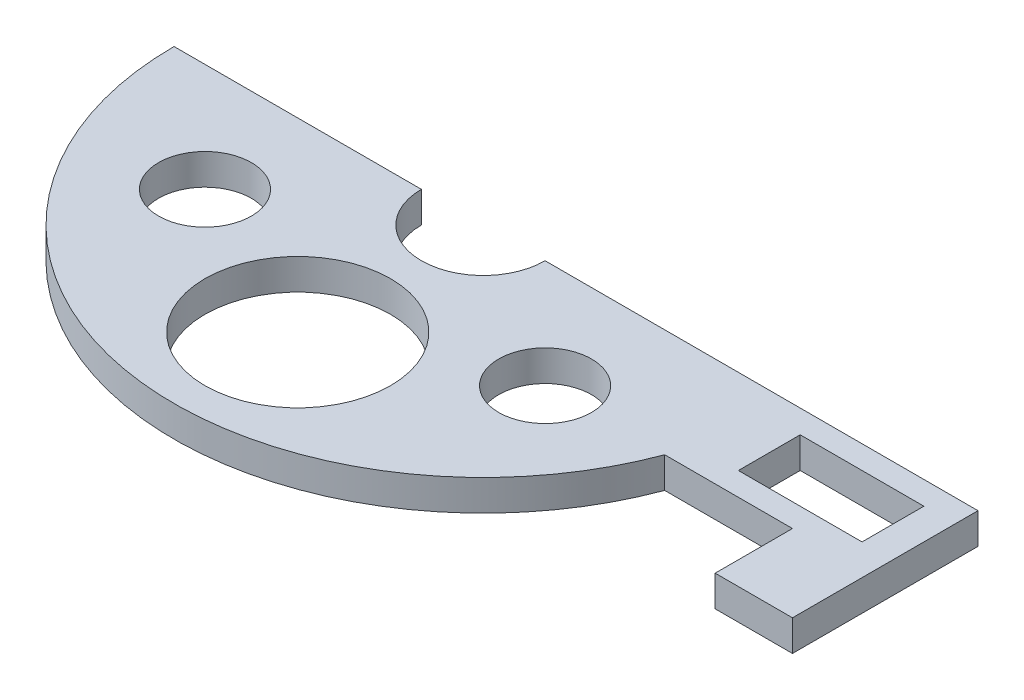
ISO-10303-21;
HEADER;
FILE_DESCRIPTION(('STEP AP214'),'2;1');
FILE_NAME('part.step','',(''),(''),'','','');
FILE_SCHEMA(('AUTOMOTIVE_DESIGN { 1 0 10303 214 1 1 1 1 }'));
ENDSEC;
DATA;
#1=APPLICATION_CONTEXT('core data for automotive mechanical design processes');
#2=APPLICATION_PROTOCOL_DEFINITION('international standard','automotive_design',2000,#1);
#3=PRODUCT_CONTEXT('',#1,'mechanical');
#4=PRODUCT('Part','Part','',(#3));
#5=PRODUCT_RELATED_PRODUCT_CATEGORY('part','',(#4));
#6=PRODUCT_DEFINITION_FORMATION('','',#4);
#7=PRODUCT_DEFINITION_CONTEXT('part definition',#1,'design');
#8=PRODUCT_DEFINITION('design','',#6,#7);
#9=PRODUCT_DEFINITION_SHAPE('','',#8);
#10=(LENGTH_UNIT() NAMED_UNIT(*) SI_UNIT(.MILLI.,.METRE.));
#11=(NAMED_UNIT(*) PLANE_ANGLE_UNIT() SI_UNIT($,.RADIAN.));
#12=(NAMED_UNIT(*) SI_UNIT($,.STERADIAN.) SOLID_ANGLE_UNIT());
#13=UNCERTAINTY_MEASURE_WITH_UNIT(LENGTH_MEASURE(1.E-05),#10,'distance_accuracy_value','');
#14=(GEOMETRIC_REPRESENTATION_CONTEXT(3) GLOBAL_UNCERTAINTY_ASSIGNED_CONTEXT((#13)) GLOBAL_UNIT_ASSIGNED_CONTEXT((#10,
#11,#12)) REPRESENTATION_CONTEXT('',''));
#15=CARTESIAN_POINT('',(0.,0.,0.));
#16=DIRECTION('',(0.,0.,1.));
#17=DIRECTION('',(1.,0.,0.));
#18=AXIS2_PLACEMENT_3D('',#15,#16,#17);
#19=CARTESIAN_POINT('',(0.,0.5,-26.8028810632146));
#20=DIRECTION('',(0.,0.,1.));
#21=DIRECTION('',(1.,0.,0.));
#22=AXIS2_PLACEMENT_3D('',#19,#20,#21);
#23=PLANE('',#22);
#24=DIRECTION('',(-1.,0.,0.));
#25=VECTOR('',#24,1.);
#26=CARTESIAN_POINT('',(0.,0.,-26.8028810632146));
#27=LINE('',#26,#25);
#28=CARTESIAN_POINT('',(-31.0035180635532,0.,-26.8028810632146));
#29=VERTEX_POINT('',#28);
#30=CARTESIAN_POINT('',(-33.0035180635532,0.,-26.8028810632146));
#31=VERTEX_POINT('',#30);
#32=EDGE_CURVE('E207',#29,#31,#27,.T.);
#33=ORIENTED_EDGE('',*,*,#32,.F.);
#34=DIRECTION('',(0.,-1.,0.));
#35=VECTOR('',#34,1.);
#36=CARTESIAN_POINT('',(-31.0035180635532,0.5,-26.8028810632146));
#37=LINE('',#36,#35);
#38=CARTESIAN_POINT('',(-31.0035180635532,0.5,-26.8028810632146));
#39=VERTEX_POINT('',#38);
#40=EDGE_CURVE('E11',#39,#29,#37,.T.);
#41=ORIENTED_EDGE('',*,*,#40,.F.);
#42=DIRECTION('',(-1.,0.,0.));
#43=VECTOR('',#42,1.);
#44=CARTESIAN_POINT('',(0.,0.5,-26.8028810632146));
#45=LINE('',#44,#43);
#46=CARTESIAN_POINT('',(-33.0035180635532,0.5,-26.8028810632146));
#47=VERTEX_POINT('',#46);
#48=EDGE_CURVE('E154',#39,#47,#45,.T.);
#49=ORIENTED_EDGE('',*,*,#48,.T.);
#50=DIRECTION('',(0.,-1.,0.));
#51=VECTOR('',#50,1.);
#52=CARTESIAN_POINT('',(-33.0035180635532,0.5,-26.8028810632146));
#53=LINE('',#52,#51);
#54=EDGE_CURVE('E61',#47,#31,#53,.T.);
#55=ORIENTED_EDGE('',*,*,#54,.T.);
#56=EDGE_LOOP('',(#33,#41,#49,#55));
#57=FACE_BOUND('',#56,.T.);
#58=ADVANCED_FACE('F41',(#57),#23,.T.);
#59=CARTESIAN_POINT('',(-31.0035180635532,0.5,0.));
#60=DIRECTION('',(-1.,0.,0.));
#61=DIRECTION('',(0.,0.,1.));
#62=AXIS2_PLACEMENT_3D('',#59,#60,#61);
#63=PLANE('',#62);
#64=DIRECTION('',(0.,0.,-1.));
#65=VECTOR('',#64,1.);
#66=CARTESIAN_POINT('',(-31.0035180635532,0.,0.));
#67=LINE('',#66,#65);
#68=CARTESIAN_POINT('',(-31.0035180635532,0.,-25.8028810632146));
#69=VERTEX_POINT('',#68);
#70=EDGE_CURVE('E142',#69,#29,#67,.T.);
#71=ORIENTED_EDGE('',*,*,#70,.F.);
#72=DIRECTION('',(0.,-1.,0.));
#73=VECTOR('',#72,1.);
#74=CARTESIAN_POINT('',(-31.0035180635532,0.5,-25.8028810632146));
#75=LINE('',#74,#73);
#76=CARTESIAN_POINT('',(-31.0035180635532,0.5,-25.8028810632146));
#77=VERTEX_POINT('',#76);
#78=EDGE_CURVE('E52',#77,#69,#75,.T.);
#79=ORIENTED_EDGE('',*,*,#78,.F.);
#80=DIRECTION('',(0.,0.,-1.));
#81=VECTOR('',#80,1.);
#82=CARTESIAN_POINT('',(-31.0035180635532,0.5,0.));
#83=LINE('',#82,#81);
#84=EDGE_CURVE('E140',#77,#39,#83,.T.);
#85=ORIENTED_EDGE('',*,*,#84,.T.);
#86=ORIENTED_EDGE('',*,*,#40,.T.);
#87=EDGE_LOOP('',(#71,#79,#85,#86));
#88=FACE_BOUND('',#87,.T.);
#89=ADVANCED_FACE('F139',(#88),#63,.T.);
#90=CARTESIAN_POINT('',(0.,0.5,-25.8028810632146));
#91=DIRECTION('',(0.,0.,-1.));
#92=DIRECTION('',(-1.,0.,0.));
#93=AXIS2_PLACEMENT_3D('',#90,#91,#92);
#94=PLANE('',#93);
#95=DIRECTION('',(1.,0.,0.));
#96=VECTOR('',#95,1.);
#97=CARTESIAN_POINT('',(0.,0.,-25.8028810632146));
#98=LINE('',#97,#96);
#99=CARTESIAN_POINT('',(-33.0035180635532,0.,-25.8028810632146));
#100=VERTEX_POINT('',#99);
#101=EDGE_CURVE('E212',#100,#69,#98,.T.);
#102=ORIENTED_EDGE('',*,*,#101,.F.);
#103=DIRECTION('',(0.,-1.,0.));
#104=VECTOR('',#103,1.);
#105=CARTESIAN_POINT('',(-33.0035180635532,0.5,-25.8028810632146));
#106=LINE('',#105,#104);
#107=CARTESIAN_POINT('',(-33.0035180635532,0.5,-25.8028810632146));
#108=VERTEX_POINT('',#107);
#109=EDGE_CURVE('E98',#108,#100,#106,.T.);
#110=ORIENTED_EDGE('',*,*,#109,.F.);
#111=DIRECTION('',(1.,0.,0.));
#112=VECTOR('',#111,1.);
#113=CARTESIAN_POINT('',(0.,0.5,-25.8028810632146));
#114=LINE('',#113,#112);
#115=EDGE_CURVE('E153',#108,#77,#114,.T.);
#116=ORIENTED_EDGE('',*,*,#115,.T.);
#117=ORIENTED_EDGE('',*,*,#78,.T.);
#118=EDGE_LOOP('',(#102,#110,#116,#117));
#119=FACE_BOUND('',#118,.T.);
#120=ADVANCED_FACE('F157',(#119),#94,.T.);
#121=CARTESIAN_POINT('',(-38.5035180635532,0.5,-27.1778810632146));
#122=DIRECTION('',(0.,-1.,0.));
#123=DIRECTION('',(0.,0.,-1.));
#124=AXIS2_PLACEMENT_3D('',#121,#122,#123);
#125=CYLINDRICAL_SURFACE('',#124,1.);
#126=CARTESIAN_POINT('',(-38.5035180635532,0.,-27.1778810632146));
#127=DIRECTION('',(0.,1.,0.));
#128=DIRECTION('',(0.,0.,1.));
#129=AXIS2_PLACEMENT_3D('',#126,#127,#128);
#130=CIRCLE('',#129,1.);
#131=CARTESIAN_POINT('',(-39.5035180635532,0.,-27.1778810632146));
#132=VERTEX_POINT('',#131);
#133=CARTESIAN_POINT('',(-37.5035180635532,0.,-27.1778810632146));
#134=VERTEX_POINT('',#133);
#135=EDGE_CURVE('E178',#132,#134,#130,.T.);
#136=ORIENTED_EDGE('',*,*,#135,.F.);
#137=DIRECTION('',(0.,-1.,0.));
#138=VECTOR('',#137,1.);
#139=CARTESIAN_POINT('',(-39.5035180635532,0.5,-27.1778810632146));
#140=LINE('',#139,#138);
#141=CARTESIAN_POINT('',(-39.5035180635532,0.5,-27.1778810632146));
#142=VERTEX_POINT('',#141);
#143=EDGE_CURVE('E45',#142,#132,#140,.T.);
#144=ORIENTED_EDGE('',*,*,#143,.F.);
#145=CARTESIAN_POINT('',(-38.5035180635532,0.5,-27.1778810632146));
#146=DIRECTION('',(0.,1.,0.));
#147=DIRECTION('',(0.,0.,1.));
#148=AXIS2_PLACEMENT_3D('',#145,#146,#147);
#149=CIRCLE('',#148,1.);
#150=CARTESIAN_POINT('',(-37.5035180635532,0.5,-27.1778810632146));
#151=VERTEX_POINT('',#150);
#152=EDGE_CURVE('E294',#142,#151,#149,.T.);
#153=ORIENTED_EDGE('',*,*,#152,.T.);
#154=DIRECTION('',(0.,-1.,0.));
#155=VECTOR('',#154,1.);
#156=CARTESIAN_POINT('',(-37.5035180635532,0.5,-27.1778810632146));
#157=LINE('',#156,#155);
#158=EDGE_CURVE('E162',#151,#134,#157,.T.);
#159=ORIENTED_EDGE('',*,*,#158,.T.);
#160=EDGE_LOOP('',(#136,#144,#153,#159));
#161=FACE_BOUND('',#160,.T.);
#162=ADVANCED_FACE('F252',(#161),#125,.F.);
#163=CARTESIAN_POINT('',(0.,0.5,-27.1778810632146));
#164=DIRECTION('',(0.,0.,-1.));
#165=DIRECTION('',(-1.,0.,0.));
#166=AXIS2_PLACEMENT_3D('',#163,#164,#165);
#167=PLANE('',#166);
#168=DIRECTION('',(1.,0.,0.));
#169=VECTOR('',#168,1.);
#170=CARTESIAN_POINT('',(0.,0.,-27.1778810632146));
#171=LINE('',#170,#169);
#172=CARTESIAN_POINT('',(-43.5035180635532,0.,-27.1778810632146));
#173=VERTEX_POINT('',#172);
#174=EDGE_CURVE('E182',#173,#132,#171,.T.);
#175=ORIENTED_EDGE('',*,*,#174,.F.);
#176=DIRECTION('',(0.,-1.,0.));
#177=VECTOR('',#176,1.);
#178=CARTESIAN_POINT('',(-43.5035180635532,0.5,-27.1778810632146));
#179=LINE('',#178,#177);
#180=CARTESIAN_POINT('',(-43.5035180635532,0.5,-27.1778810632146));
#181=VERTEX_POINT('',#180);
#182=EDGE_CURVE('E240',#181,#173,#179,.T.);
#183=ORIENTED_EDGE('',*,*,#182,.F.);
#184=DIRECTION('',(1.,0.,0.));
#185=VECTOR('',#184,1.);
#186=CARTESIAN_POINT('',(0.,0.5,-27.1778810632146));
#187=LINE('',#186,#185);
#188=EDGE_CURVE('E251',#181,#142,#187,.T.);
#189=ORIENTED_EDGE('',*,*,#188,.T.);
#190=ORIENTED_EDGE('',*,*,#143,.T.);
#191=EDGE_LOOP('',(#175,#183,#189,#190));
#192=FACE_BOUND('',#191,.T.);
#193=ADVANCED_FACE('F249',(#192),#167,.T.);
#194=CARTESIAN_POINT('',(-38.5035180635532,0.5,-27.1778810632146));
#195=DIRECTION('',(0.,-1.,0.));
#196=DIRECTION('',(0.,0.,-1.));
#197=AXIS2_PLACEMENT_3D('',#194,#195,#196);
#198=CYLINDRICAL_SURFACE('',#197,5.);
#199=CARTESIAN_POINT('',(-38.5035180635532,0.,-27.1778810632146));
#200=DIRECTION('',(0.,1.,0.));
#201=DIRECTION('',(0.,0.,1.));
#202=AXIS2_PLACEMENT_3D('',#199,#200,#201);
#203=CIRCLE('',#202,5.);
#204=CARTESIAN_POINT('',(-33.8197695647544,0.,-25.4278810632146));
#205=VERTEX_POINT('',#204);
#206=EDGE_CURVE('E186',#173,#205,#203,.T.);
#207=ORIENTED_EDGE('',*,*,#206,.T.);
#208=DIRECTION('',(0.,-1.,0.));
#209=VECTOR('',#208,1.);
#210=CARTESIAN_POINT('',(-33.8197695647544,0.5,-25.4278810632146));
#211=LINE('',#210,#209);
#212=CARTESIAN_POINT('',(-33.8197695647544,0.5,-25.4278810632146));
#213=VERTEX_POINT('',#212);
#214=EDGE_CURVE('E238',#213,#205,#211,.T.);
#215=ORIENTED_EDGE('',*,*,#214,.F.);
#216=CARTESIAN_POINT('',(-38.5035180635532,0.5,-27.1778810632146));
#217=DIRECTION('',(0.,1.,0.));
#218=DIRECTION('',(0.,0.,1.));
#219=AXIS2_PLACEMENT_3D('',#216,#217,#218);
#220=CIRCLE('',#219,5.);
#221=EDGE_CURVE('E262',#181,#213,#220,.T.);
#222=ORIENTED_EDGE('',*,*,#221,.F.);
#223=ORIENTED_EDGE('',*,*,#182,.T.);
#224=EDGE_LOOP('',(#207,#215,#222,#223));
#225=FACE_BOUND('',#224,.T.);
#226=ADVANCED_FACE('F260',(#225),#198,.T.);
#227=CARTESIAN_POINT('',(0.,0.5,-25.4278810632146));
#228=DIRECTION('',(0.,0.,1.));
#229=DIRECTION('',(1.,0.,0.));
#230=AXIS2_PLACEMENT_3D('',#227,#228,#229);
#231=PLANE('',#230);
#232=DIRECTION('',(-1.,0.,0.));
#233=VECTOR('',#232,1.);
#234=CARTESIAN_POINT('',(0.,0.,-25.4278810632146));
#235=LINE('',#234,#233);
#236=CARTESIAN_POINT('',(-31.7535180635532,0.,-25.4278810632146));
#237=VERTEX_POINT('',#236);
#238=EDGE_CURVE('E191',#237,#205,#235,.T.);
#239=ORIENTED_EDGE('',*,*,#238,.F.);
#240=DIRECTION('',(0.,-1.,0.));
#241=VECTOR('',#240,1.);
#242=CARTESIAN_POINT('',(-31.7535180635532,0.5,-25.4278810632146));
#243=LINE('',#242,#241);
#244=CARTESIAN_POINT('',(-31.7535180635532,0.5,-25.4278810632146));
#245=VERTEX_POINT('',#244);
#246=EDGE_CURVE('E235',#245,#237,#243,.T.);
#247=ORIENTED_EDGE('',*,*,#246,.F.);
#248=DIRECTION('',(-1.,0.,0.));
#249=VECTOR('',#248,1.);
#250=CARTESIAN_POINT('',(0.,0.5,-25.4278810632146));
#251=LINE('',#250,#249);
#252=EDGE_CURVE('E265',#245,#213,#251,.T.);
#253=ORIENTED_EDGE('',*,*,#252,.T.);
#254=ORIENTED_EDGE('',*,*,#214,.T.);
#255=EDGE_LOOP('',(#239,#247,#253,#254));
#256=FACE_BOUND('',#255,.T.);
#257=ADVANCED_FACE('F266',(#256),#231,.T.);
#258=CARTESIAN_POINT('',(-31.7535180635532,0.5,0.));
#259=DIRECTION('',(-1.,0.,0.));
#260=DIRECTION('',(0.,0.,1.));
#261=AXIS2_PLACEMENT_3D('',#258,#259,#260);
#262=PLANE('',#261);
#263=DIRECTION('',(0.,0.,-1.));
#264=VECTOR('',#263,1.);
#265=CARTESIAN_POINT('',(-31.7535180635532,0.,0.));
#266=LINE('',#265,#264);
#267=CARTESIAN_POINT('',(-31.7535180635532,0.,-24.1778810632146));
#268=VERTEX_POINT('',#267);
#269=EDGE_CURVE('E195',#268,#237,#266,.T.);
#270=ORIENTED_EDGE('',*,*,#269,.F.);
#271=DIRECTION('',(0.,-1.,0.));
#272=VECTOR('',#271,1.);
#273=CARTESIAN_POINT('',(-31.7535180635532,0.5,-24.1778810632146));
#274=LINE('',#273,#272);
#275=CARTESIAN_POINT('',(-31.7535180635532,0.5,-24.1778810632146));
#276=VERTEX_POINT('',#275);
#277=EDGE_CURVE('E232',#276,#268,#274,.T.);
#278=ORIENTED_EDGE('',*,*,#277,.F.);
#279=DIRECTION('',(0.,0.,-1.));
#280=VECTOR('',#279,1.);
#281=CARTESIAN_POINT('',(-31.7535180635532,0.5,0.));
#282=LINE('',#281,#280);
#283=EDGE_CURVE('E271',#276,#245,#282,.T.);
#284=ORIENTED_EDGE('',*,*,#283,.T.);
#285=ORIENTED_EDGE('',*,*,#246,.T.);
#286=EDGE_LOOP('',(#270,#278,#284,#285));
#287=FACE_BOUND('',#286,.T.);
#288=ADVANCED_FACE('F330',(#287),#262,.T.);
#289=CARTESIAN_POINT('',(0.,0.5,-24.1778810632146));
#290=DIRECTION('',(0.,0.,1.));
#291=DIRECTION('',(1.,0.,0.));
#292=AXIS2_PLACEMENT_3D('',#289,#290,#291);
#293=PLANE('',#292);
#294=DIRECTION('',(-1.,0.,0.));
#295=VECTOR('',#294,1.);
#296=CARTESIAN_POINT('',(0.,0.,-24.1778810632146));
#297=LINE('',#296,#295);
#298=CARTESIAN_POINT('',(-30.5035180635532,0.,-24.1778810632146));
#299=VERTEX_POINT('',#298);
#300=EDGE_CURVE('E199',#299,#268,#297,.T.);
#301=ORIENTED_EDGE('',*,*,#300,.F.);
#302=DIRECTION('',(0.,-1.,0.));
#303=VECTOR('',#302,1.);
#304=CARTESIAN_POINT('',(-30.5035180635532,0.5,-24.1778810632146));
#305=LINE('',#304,#303);
#306=CARTESIAN_POINT('',(-30.5035180635532,0.5,-24.1778810632146));
#307=VERTEX_POINT('',#306);
#308=EDGE_CURVE('E229',#307,#299,#305,.T.);
#309=ORIENTED_EDGE('',*,*,#308,.F.);
#310=DIRECTION('',(-1.,0.,0.));
#311=VECTOR('',#310,1.);
#312=CARTESIAN_POINT('',(0.,0.5,-24.1778810632146));
#313=LINE('',#312,#311);
#314=EDGE_CURVE('E275',#307,#276,#313,.T.);
#315=ORIENTED_EDGE('',*,*,#314,.T.);
#316=ORIENTED_EDGE('',*,*,#277,.T.);
#317=EDGE_LOOP('',(#301,#309,#315,#316));
#318=FACE_BOUND('',#317,.T.);
#319=ADVANCED_FACE('F328',(#318),#293,.T.);
#320=CARTESIAN_POINT('',(-30.5035180635532,0.5,0.));
#321=DIRECTION('',(1.,0.,0.));
#322=DIRECTION('',(0.,0.,-1.));
#323=AXIS2_PLACEMENT_3D('',#320,#321,#322);
#324=PLANE('',#323);
#325=DIRECTION('',(0.,0.,1.));
#326=VECTOR('',#325,1.);
#327=CARTESIAN_POINT('',(-30.5035180635532,0.,0.));
#328=LINE('',#327,#326);
#329=CARTESIAN_POINT('',(-30.5035180635532,0.,-27.1778810632146));
#330=VERTEX_POINT('',#329);
#331=EDGE_CURVE('E203',#330,#299,#328,.T.);
#332=ORIENTED_EDGE('',*,*,#331,.F.);
#333=DIRECTION('',(0.,-1.,0.));
#334=VECTOR('',#333,1.);
#335=CARTESIAN_POINT('',(-30.5035180635532,0.5,-27.1778810632146));
#336=LINE('',#335,#334);
#337=CARTESIAN_POINT('',(-30.5035180635532,0.5,-27.1778810632146));
#338=VERTEX_POINT('',#337);
#339=EDGE_CURVE('E226',#338,#330,#336,.T.);
#340=ORIENTED_EDGE('',*,*,#339,.F.);
#341=DIRECTION('',(0.,0.,1.));
#342=VECTOR('',#341,1.);
#343=CARTESIAN_POINT('',(-30.5035180635532,0.5,0.));
#344=LINE('',#343,#342);
#345=EDGE_CURVE('E283',#338,#307,#344,.T.);
#346=ORIENTED_EDGE('',*,*,#345,.T.);
#347=ORIENTED_EDGE('',*,*,#308,.T.);
#348=EDGE_LOOP('',(#332,#340,#346,#347));
#349=FACE_BOUND('',#348,.T.);
#350=ADVANCED_FACE('F322',(#349),#324,.T.);
#351=EDGE_CURVE('E187',#134,#330,#171,.T.);
#352=ORIENTED_EDGE('',*,*,#351,.F.);
#353=ORIENTED_EDGE('',*,*,#158,.F.);
#354=EDGE_CURVE('E286',#151,#338,#187,.T.);
#355=ORIENTED_EDGE('',*,*,#354,.T.);
#356=ORIENTED_EDGE('',*,*,#339,.T.);
#357=EDGE_LOOP('',(#352,#353,#355,#356));
#358=FACE_BOUND('',#357,.T.);
#359=ADVANCED_FACE('F324',(#358),#167,.T.);
#360=CARTESIAN_POINT('',(-41.2535180635532,0.5,-25.4278810632146));
#361=DIRECTION('',(0.,-1.,0.));
#362=DIRECTION('',(0.,0.,-1.));
#363=AXIS2_PLACEMENT_3D('',#360,#361,#362);
#364=CYLINDRICAL_SURFACE('',#363,0.749999999999999);
#365=CARTESIAN_POINT('',(-41.2535180635532,0.5,-25.4278810632146));
#366=DIRECTION('',(0.,1.,0.));
#367=DIRECTION('',(0.,0.,1.));
#368=AXIS2_PLACEMENT_3D('',#365,#366,#367);
#369=CIRCLE('',#368,0.749999999999999);
#370=CARTESIAN_POINT('',(-41.2535180635532,0.5,-24.6778810632146));
#371=VERTEX_POINT('',#370);
#372=EDGE_CURVE('E296',#371,#371,#369,.T.);
#373=ORIENTED_EDGE('',*,*,#372,.T.);
#374=EDGE_LOOP('',(#373));
#375=FACE_BOUND('',#374,.T.);
#376=CARTESIAN_POINT('',(-41.2535180635532,0.,-25.4278810632146));
#377=DIRECTION('',(0.,1.,0.));
#378=DIRECTION('',(0.,0.,1.));
#379=AXIS2_PLACEMENT_3D('',#376,#377,#378);
#380=CIRCLE('',#379,0.749999999999999);
#381=CARTESIAN_POINT('',(-41.2535180635532,0.,-24.6778810632146));
#382=VERTEX_POINT('',#381);
#383=EDGE_CURVE('E174',#382,#382,#380,.T.);
#384=ORIENTED_EDGE('',*,*,#383,.F.);
#385=EDGE_LOOP('',(#384));
#386=FACE_BOUND('',#385,.T.);
#387=ADVANCED_FACE('F349',(#375,#386),#364,.F.);
#388=CARTESIAN_POINT('',(-35.7535180635532,0.5,-25.4278810632146));
#389=DIRECTION('',(0.,-1.,0.));
#390=DIRECTION('',(0.,0.,-1.));
#391=AXIS2_PLACEMENT_3D('',#388,#389,#390);
#392=CYLINDRICAL_SURFACE('',#391,0.749999999999999);
#393=CARTESIAN_POINT('',(-35.7535180635532,0.5,-25.4278810632146));
#394=DIRECTION('',(0.,1.,0.));
#395=DIRECTION('',(0.,0.,1.));
#396=AXIS2_PLACEMENT_3D('',#393,#394,#395);
#397=CIRCLE('',#396,0.749999999999999);
#398=CARTESIAN_POINT('',(-35.7535180635532,0.5,-24.6778810632146));
#399=VERTEX_POINT('',#398);
#400=EDGE_CURVE('E299',#399,#399,#397,.T.);
#401=ORIENTED_EDGE('',*,*,#400,.T.);
#402=EDGE_LOOP('',(#401));
#403=FACE_BOUND('',#402,.T.);
#404=CARTESIAN_POINT('',(-35.7535180635532,0.,-25.4278810632146));
#405=DIRECTION('',(0.,1.,0.));
#406=DIRECTION('',(0.,0.,1.));
#407=AXIS2_PLACEMENT_3D('',#404,#405,#406);
#408=CIRCLE('',#407,0.749999999999999);
#409=CARTESIAN_POINT('',(-35.7535180635532,0.,-24.6778810632146));
#410=VERTEX_POINT('',#409);
#411=EDGE_CURVE('E170',#410,#410,#408,.T.);
#412=ORIENTED_EDGE('',*,*,#411,.F.);
#413=EDGE_LOOP('',(#412));
#414=FACE_BOUND('',#413,.T.);
#415=ADVANCED_FACE('F365',(#403,#414),#392,.F.);
#416=CARTESIAN_POINT('',(-38.5035180635532,0.5,-24.1778810632146));
#417=DIRECTION('',(0.,-1.,0.));
#418=DIRECTION('',(0.,0.,-1.));
#419=AXIS2_PLACEMENT_3D('',#416,#417,#418);
#420=CYLINDRICAL_SURFACE('',#419,1.5);
#421=CARTESIAN_POINT('',(-38.5035180635532,0.5,-24.1778810632146));
#422=DIRECTION('',(0.,1.,0.));
#423=DIRECTION('',(0.,0.,1.));
#424=AXIS2_PLACEMENT_3D('',#421,#422,#423);
#425=CIRCLE('',#424,1.5);
#426=CARTESIAN_POINT('',(-38.5035180635532,0.5,-22.6778810632146));
#427=VERTEX_POINT('',#426);
#428=EDGE_CURVE('E219',#427,#427,#425,.T.);
#429=ORIENTED_EDGE('',*,*,#428,.T.);
#430=EDGE_LOOP('',(#429));
#431=FACE_BOUND('',#430,.T.);
#432=CARTESIAN_POINT('',(-38.5035180635532,0.,-24.1778810632146));
#433=DIRECTION('',(0.,1.,0.));
#434=DIRECTION('',(0.,0.,1.));
#435=AXIS2_PLACEMENT_3D('',#432,#433,#434);
#436=CIRCLE('',#435,1.5);
#437=CARTESIAN_POINT('',(-38.5035180635532,0.,-22.6778810632146));
#438=VERTEX_POINT('',#437);
#439=EDGE_CURVE('E166',#438,#438,#436,.T.);
#440=ORIENTED_EDGE('',*,*,#439,.F.);
#441=EDGE_LOOP('',(#440));
#442=FACE_BOUND('',#441,.T.);
#443=ADVANCED_FACE('F43',(#431,#442),#420,.F.);
#444=CARTESIAN_POINT('',(-33.0035180635532,0.5,0.));
#445=DIRECTION('',(1.,0.,0.));
#446=DIRECTION('',(0.,0.,-1.));
#447=AXIS2_PLACEMENT_3D('',#444,#445,#446);
#448=PLANE('',#447);
#449=DIRECTION('',(0.,0.,1.));
#450=VECTOR('',#449,1.);
#451=CARTESIAN_POINT('',(-33.0035180635532,0.,0.));
#452=LINE('',#451,#450);
#453=EDGE_CURVE('E215',#31,#100,#452,.T.);
#454=ORIENTED_EDGE('',*,*,#453,.F.);
#455=ORIENTED_EDGE('',*,*,#54,.F.);
#456=DIRECTION('',(0.,0.,1.));
#457=VECTOR('',#456,1.);
#458=CARTESIAN_POINT('',(-33.0035180635532,0.5,0.));
#459=LINE('',#458,#457);
#460=EDGE_CURVE('E159',#47,#108,#459,.T.);
#461=ORIENTED_EDGE('',*,*,#460,.T.);
#462=ORIENTED_EDGE('',*,*,#109,.T.);
#463=EDGE_LOOP('',(#454,#455,#461,#462));
#464=FACE_BOUND('',#463,.T.);
#465=ADVANCED_FACE('F313',(#464),#448,.T.);
#466=CARTESIAN_POINT('',(0.,0.5,0.));
#467=DIRECTION('',(0.,1.,0.));
#468=DIRECTION('',(0.,0.,1.));
#469=AXIS2_PLACEMENT_3D('',#466,#467,#468);
#470=PLANE('',#469);
#471=ORIENTED_EDGE('',*,*,#428,.F.);
#472=EDGE_LOOP('',(#471));
#473=FACE_BOUND('',#472,.T.);
#474=ORIENTED_EDGE('',*,*,#400,.F.);
#475=EDGE_LOOP('',(#474));
#476=FACE_BOUND('',#475,.T.);
#477=ORIENTED_EDGE('',*,*,#372,.F.);
#478=EDGE_LOOP('',(#477));
#479=FACE_BOUND('',#478,.T.);
#480=ORIENTED_EDGE('',*,*,#152,.F.);
#481=ORIENTED_EDGE('',*,*,#188,.F.);
#482=ORIENTED_EDGE('',*,*,#221,.T.);
#483=ORIENTED_EDGE('',*,*,#252,.F.);
#484=ORIENTED_EDGE('',*,*,#283,.F.);
#485=ORIENTED_EDGE('',*,*,#314,.F.);
#486=ORIENTED_EDGE('',*,*,#345,.F.);
#487=ORIENTED_EDGE('',*,*,#354,.F.);
#488=EDGE_LOOP('',(#480,#481,#482,#483,#484,#485,#486,#487));
#489=FACE_BOUND('',#488,.T.);
#490=ORIENTED_EDGE('',*,*,#48,.F.);
#491=ORIENTED_EDGE('',*,*,#84,.F.);
#492=ORIENTED_EDGE('',*,*,#115,.F.);
#493=ORIENTED_EDGE('',*,*,#460,.F.);
#494=EDGE_LOOP('',(#490,#491,#492,#493));
#495=FACE_BOUND('',#494,.T.);
#496=ADVANCED_FACE('F151',(#473,#476,#479,#489,#495),#470,.T.);
#497=CARTESIAN_POINT('',(0.,0.,0.));
#498=DIRECTION('',(0.,1.,0.));
#499=DIRECTION('',(0.,0.,1.));
#500=AXIS2_PLACEMENT_3D('',#497,#498,#499);
#501=PLANE('',#500);
#502=ORIENTED_EDGE('',*,*,#439,.T.);
#503=EDGE_LOOP('',(#502));
#504=FACE_BOUND('',#503,.T.);
#505=ORIENTED_EDGE('',*,*,#411,.T.);
#506=EDGE_LOOP('',(#505));
#507=FACE_BOUND('',#506,.T.);
#508=ORIENTED_EDGE('',*,*,#383,.T.);
#509=EDGE_LOOP('',(#508));
#510=FACE_BOUND('',#509,.T.);
#511=ORIENTED_EDGE('',*,*,#135,.T.);
#512=ORIENTED_EDGE('',*,*,#351,.T.);
#513=ORIENTED_EDGE('',*,*,#331,.T.);
#514=ORIENTED_EDGE('',*,*,#300,.T.);
#515=ORIENTED_EDGE('',*,*,#269,.T.);
#516=ORIENTED_EDGE('',*,*,#238,.T.);
#517=ORIENTED_EDGE('',*,*,#206,.F.);
#518=ORIENTED_EDGE('',*,*,#174,.T.);
#519=EDGE_LOOP('',(#511,#512,#513,#514,#515,#516,#517,#518));
#520=FACE_BOUND('',#519,.T.);
#521=ORIENTED_EDGE('',*,*,#32,.T.);
#522=ORIENTED_EDGE('',*,*,#453,.T.);
#523=ORIENTED_EDGE('',*,*,#101,.T.);
#524=ORIENTED_EDGE('',*,*,#70,.T.);
#525=EDGE_LOOP('',(#521,#522,#523,#524));
#526=FACE_BOUND('',#525,.T.);
#527=ADVANCED_FACE('F256',(#504,#507,#510,#520,#526),#501,.F.);
#528=CLOSED_SHELL('',(#58,#89,#120,#162,#193,#226,#257,#288,#319,#350,#359,#387,#415,#443,#465,
#496,#527));
#529=MANIFOLD_SOLID_BREP('B2',#528);
#530=ADVANCED_BREP_SHAPE_REPRESENTATION('',(#18,#529),#14);
#531=SHAPE_DEFINITION_REPRESENTATION(#9,#530);
ENDSEC;
END-ISO-10303-21;
